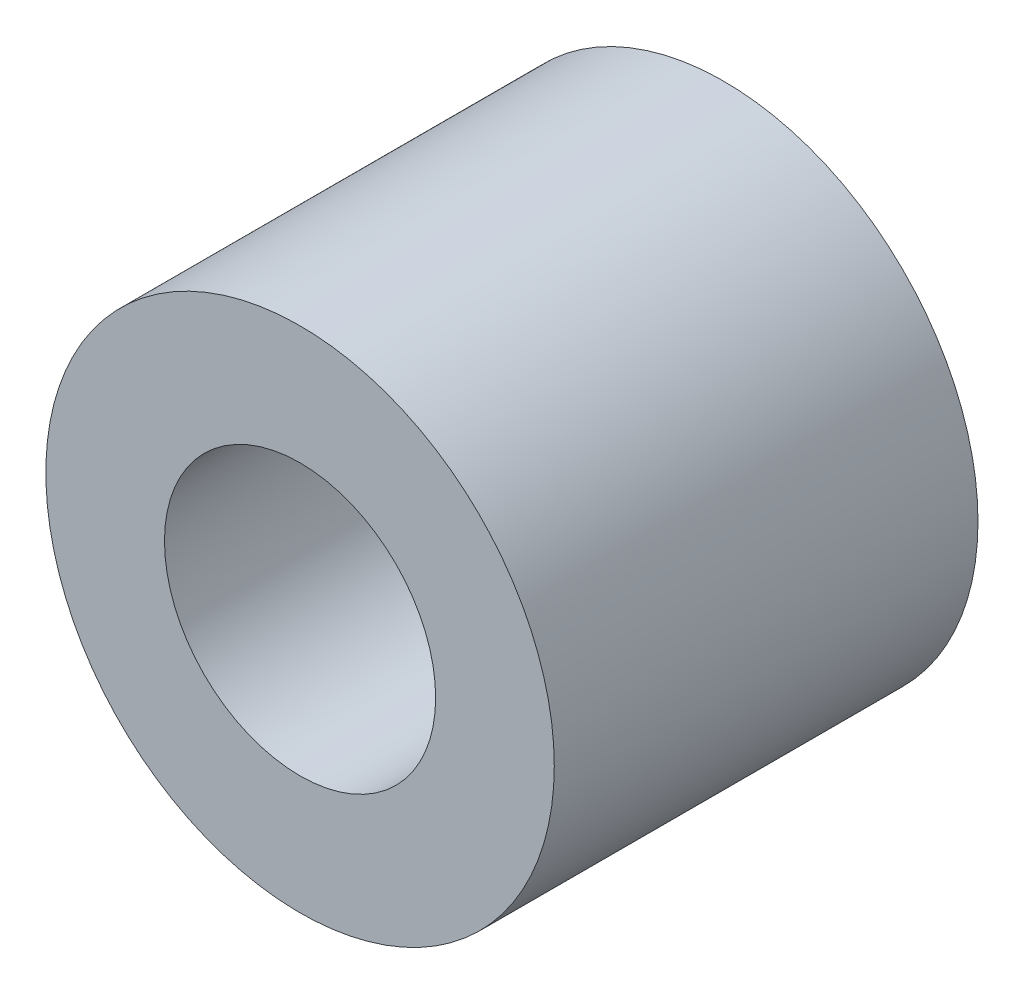
ISO-10303-21;
HEADER;
FILE_DESCRIPTION(('STEP AP214'),'2;1');
FILE_NAME('part.step','',(''),(''),'','','');
FILE_SCHEMA(('AUTOMOTIVE_DESIGN { 1 0 10303 214 1 1 1 1 }'));
ENDSEC;
DATA;
#1=APPLICATION_CONTEXT('core data for automotive mechanical design processes');
#2=APPLICATION_PROTOCOL_DEFINITION('international standard','automotive_design',2000,#1);
#3=PRODUCT_CONTEXT('',#1,'mechanical');
#4=PRODUCT('Part','Part','',(#3));
#5=PRODUCT_RELATED_PRODUCT_CATEGORY('part','',(#4));
#6=PRODUCT_DEFINITION_FORMATION('','',#4);
#7=PRODUCT_DEFINITION_CONTEXT('part definition',#1,'design');
#8=PRODUCT_DEFINITION('design','',#6,#7);
#9=PRODUCT_DEFINITION_SHAPE('','',#8);
#10=(LENGTH_UNIT() NAMED_UNIT(*) SI_UNIT(.MILLI.,.METRE.));
#11=(NAMED_UNIT(*) PLANE_ANGLE_UNIT() SI_UNIT($,.RADIAN.));
#12=(NAMED_UNIT(*) SI_UNIT($,.STERADIAN.) SOLID_ANGLE_UNIT());
#13=UNCERTAINTY_MEASURE_WITH_UNIT(LENGTH_MEASURE(1.E-05),#10,'distance_accuracy_value','');
#14=(GEOMETRIC_REPRESENTATION_CONTEXT(3) GLOBAL_UNCERTAINTY_ASSIGNED_CONTEXT((#13)) GLOBAL_UNIT_ASSIGNED_CONTEXT((#10,
#11,#12)) REPRESENTATION_CONTEXT('',''));
#15=CARTESIAN_POINT('',(0.,0.,0.));
#16=DIRECTION('',(0.,0.,1.));
#17=DIRECTION('',(1.,0.,0.));
#18=AXIS2_PLACEMENT_3D('',#15,#16,#17);
#19=CARTESIAN_POINT('',(0.,0.,2.5));
#20=DIRECTION('',(0.,0.,1.));
#21=DIRECTION('',(1.,0.,0.));
#22=AXIS2_PLACEMENT_3D('',#19,#20,#21);
#23=PLANE('',#22);
#24=CARTESIAN_POINT('',(0.,0.,2.5));
#25=DIRECTION('',(0.,0.,1.));
#26=DIRECTION('',(1.,0.,0.));
#27=AXIS2_PLACEMENT_3D('',#24,#25,#26);
#28=CIRCLE('',#27,3.);
#29=CARTESIAN_POINT('',(3.,0.,2.5));
#30=VERTEX_POINT('',#29);
#31=EDGE_CURVE('E10',#30,#30,#28,.T.);
#32=ORIENTED_EDGE('',*,*,#31,.T.);
#33=EDGE_LOOP('',(#32));
#34=FACE_BOUND('',#33,.T.);
#35=CARTESIAN_POINT('',(0.,0.,2.5));
#36=DIRECTION('',(0.,0.,1.));
#37=DIRECTION('',(1.,0.,0.));
#38=AXIS2_PLACEMENT_3D('',#35,#36,#37);
#39=CIRCLE('',#38,1.6);
#40=CARTESIAN_POINT('',(1.6,0.,2.5));
#41=VERTEX_POINT('',#40);
#42=EDGE_CURVE('E40',#41,#41,#39,.T.);
#43=ORIENTED_EDGE('',*,*,#42,.F.);
#44=EDGE_LOOP('',(#43));
#45=FACE_BOUND('',#44,.T.);
#46=ADVANCED_FACE('F29',(#34,#45),#23,.T.);
#47=CARTESIAN_POINT('',(0.,0.,-2.5));
#48=DIRECTION('',(0.,0.,1.));
#49=DIRECTION('',(1.,0.,0.));
#50=AXIS2_PLACEMENT_3D('',#47,#48,#49);
#51=PLANE('',#50);
#52=CARTESIAN_POINT('',(0.,0.,-2.5));
#53=DIRECTION('',(0.,0.,1.));
#54=DIRECTION('',(1.,0.,0.));
#55=AXIS2_PLACEMENT_3D('',#52,#53,#54);
#56=CIRCLE('',#55,3.);
#57=CARTESIAN_POINT('',(3.,0.,-2.5));
#58=VERTEX_POINT('',#57);
#59=EDGE_CURVE('E33',#58,#58,#56,.T.);
#60=ORIENTED_EDGE('',*,*,#59,.F.);
#61=EDGE_LOOP('',(#60));
#62=FACE_BOUND('',#61,.T.);
#63=CARTESIAN_POINT('',(0.,0.,-2.5));
#64=DIRECTION('',(0.,0.,1.));
#65=DIRECTION('',(1.,0.,0.));
#66=AXIS2_PLACEMENT_3D('',#63,#64,#65);
#67=CIRCLE('',#66,1.6);
#68=CARTESIAN_POINT('',(1.6,0.,-2.5));
#69=VERTEX_POINT('',#68);
#70=EDGE_CURVE('E42',#69,#69,#67,.T.);
#71=ORIENTED_EDGE('',*,*,#70,.T.);
#72=EDGE_LOOP('',(#71));
#73=FACE_BOUND('',#72,.T.);
#74=ADVANCED_FACE('F52',(#62,#73),#51,.F.);
#75=CARTESIAN_POINT('',(0.,0.,2.5));
#76=DIRECTION('',(0.,0.,-1.));
#77=DIRECTION('',(-1.,0.,0.));
#78=AXIS2_PLACEMENT_3D('',#75,#76,#77);
#79=CYLINDRICAL_SURFACE('',#78,3.);
#80=ORIENTED_EDGE('',*,*,#31,.F.);
#81=EDGE_LOOP('',(#80));
#82=FACE_BOUND('',#81,.T.);
#83=ORIENTED_EDGE('',*,*,#59,.T.);
#84=EDGE_LOOP('',(#83));
#85=FACE_BOUND('',#84,.T.);
#86=ADVANCED_FACE('F31',(#82,#85),#79,.T.);
#87=CARTESIAN_POINT('',(0.,0.,2.5));
#88=DIRECTION('',(0.,0.,-1.));
#89=DIRECTION('',(-1.,0.,0.));
#90=AXIS2_PLACEMENT_3D('',#87,#88,#89);
#91=CYLINDRICAL_SURFACE('',#90,1.6);
#92=ORIENTED_EDGE('',*,*,#42,.T.);
#93=EDGE_LOOP('',(#92));
#94=FACE_BOUND('',#93,.T.);
#95=ORIENTED_EDGE('',*,*,#70,.F.);
#96=EDGE_LOOP('',(#95));
#97=FACE_BOUND('',#96,.T.);
#98=ADVANCED_FACE('F48',(#94,#97),#91,.F.);
#99=CLOSED_SHELL('',(#46,#74,#86,#98));
#100=MANIFOLD_SOLID_BREP('B2',#99);
#101=ADVANCED_BREP_SHAPE_REPRESENTATION('',(#18,#100),#14);
#102=SHAPE_DEFINITION_REPRESENTATION(#9,#101);
ENDSEC;
END-ISO-10303-21;
